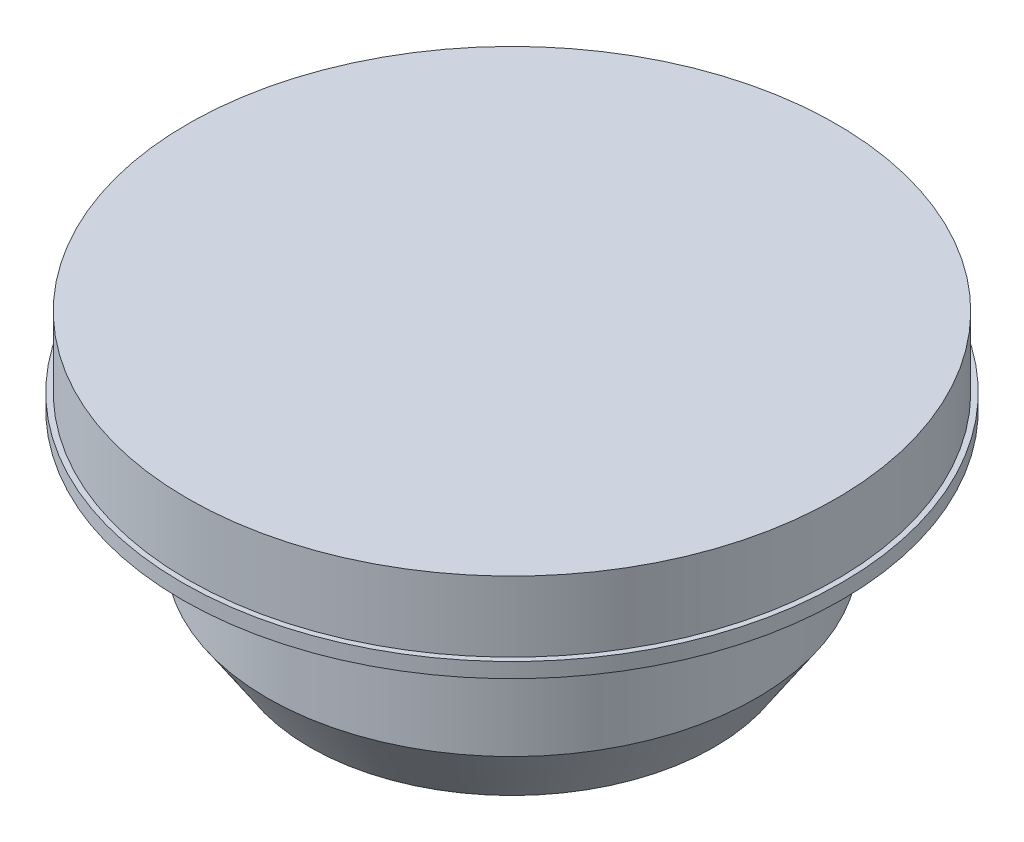
ISO-10303-21;
HEADER;
FILE_DESCRIPTION(('STEP AP214'),'2;1');
FILE_NAME('part.step','',(''),(''),'','','');
FILE_SCHEMA(('AUTOMOTIVE_DESIGN { 1 0 10303 214 1 1 1 1 }'));
ENDSEC;
DATA;
#1=APPLICATION_CONTEXT('core data for automotive mechanical design processes');
#2=APPLICATION_PROTOCOL_DEFINITION('international standard','automotive_design',2000,#1);
#3=PRODUCT_CONTEXT('',#1,'mechanical');
#4=PRODUCT('Part','Part','',(#3));
#5=PRODUCT_RELATED_PRODUCT_CATEGORY('part','',(#4));
#6=PRODUCT_DEFINITION_FORMATION('','',#4);
#7=PRODUCT_DEFINITION_CONTEXT('part definition',#1,'design');
#8=PRODUCT_DEFINITION('design','',#6,#7);
#9=PRODUCT_DEFINITION_SHAPE('','',#8);
#10=(LENGTH_UNIT() NAMED_UNIT(*) SI_UNIT(.MILLI.,.METRE.));
#11=(NAMED_UNIT(*) PLANE_ANGLE_UNIT() SI_UNIT($,.RADIAN.));
#12=(NAMED_UNIT(*) SI_UNIT($,.STERADIAN.) SOLID_ANGLE_UNIT());
#13=UNCERTAINTY_MEASURE_WITH_UNIT(LENGTH_MEASURE(1.E-05),#10,'distance_accuracy_value','');
#14=(GEOMETRIC_REPRESENTATION_CONTEXT(3) GLOBAL_UNCERTAINTY_ASSIGNED_CONTEXT((#13)) GLOBAL_UNIT_ASSIGNED_CONTEXT((#10,
#11,#12)) REPRESENTATION_CONTEXT('',''));
#15=CARTESIAN_POINT('',(0.,0.,0.));
#16=DIRECTION('',(0.,0.,1.));
#17=DIRECTION('',(1.,0.,0.));
#18=AXIS2_PLACEMENT_3D('',#15,#16,#17);
#19=CARTESIAN_POINT('',(0.,0.4,0.));
#20=DIRECTION('',(0.,-1.,0.));
#21=DIRECTION('',(0.,0.,-1.));
#22=AXIS2_PLACEMENT_3D('',#19,#20,#21);
#23=CYLINDRICAL_SURFACE('',#22,1.525);
#24=CARTESIAN_POINT('',(0.,0.07,0.));
#25=DIRECTION('',(0.,1.,0.));
#26=DIRECTION('',(0.,0.,1.));
#27=AXIS2_PLACEMENT_3D('',#24,#25,#26);
#28=CIRCLE('',#27,1.525);
#29=CARTESIAN_POINT('',(0.,0.07,1.525));
#30=VERTEX_POINT('',#29);
#31=EDGE_CURVE('E40',#30,#30,#28,.T.);
#32=ORIENTED_EDGE('',*,*,#31,.T.);
#33=EDGE_LOOP('',(#32));
#34=FACE_BOUND('',#33,.T.);
#35=CARTESIAN_POINT('',(0.,0.4,0.));
#36=DIRECTION('',(0.,1.,0.));
#37=DIRECTION('',(0.,0.,1.));
#38=AXIS2_PLACEMENT_3D('',#35,#36,#37);
#39=CIRCLE('',#38,1.525);
#40=CARTESIAN_POINT('',(0.,0.4,1.525));
#41=VERTEX_POINT('',#40);
#42=EDGE_CURVE('E10',#41,#41,#39,.T.);
#43=ORIENTED_EDGE('',*,*,#42,.F.);
#44=EDGE_LOOP('',(#43));
#45=FACE_BOUND('',#44,.T.);
#46=ADVANCED_FACE('F37',(#34,#45),#23,.T.);
#47=CARTESIAN_POINT('',(0.,0.4,0.));
#48=DIRECTION('',(0.,1.,0.));
#49=DIRECTION('',(0.,0.,1.));
#50=AXIS2_PLACEMENT_3D('',#47,#48,#49);
#51=PLANE('',#50);
#52=ORIENTED_EDGE('',*,*,#42,.T.);
#53=EDGE_LOOP('',(#52));
#54=FACE_BOUND('',#53,.T.);
#55=ADVANCED_FACE('F91',(#54),#51,.T.);
#56=CARTESIAN_POINT('',(0.,0.,0.));
#57=DIRECTION('',(0.,1.,0.));
#58=DIRECTION('',(0.,0.,1.));
#59=AXIS2_PLACEMENT_3D('',#56,#57,#58);
#60=CYLINDRICAL_SURFACE('',#59,1.55);
#61=CARTESIAN_POINT('',(0.,0.,0.));
#62=DIRECTION('',(0.,1.,0.));
#63=DIRECTION('',(0.,0.,1.));
#64=AXIS2_PLACEMENT_3D('',#61,#62,#63);
#65=CIRCLE('',#64,1.55);
#66=CARTESIAN_POINT('',(0.,0.,1.55));
#67=VERTEX_POINT('',#66);
#68=EDGE_CURVE('E47',#67,#67,#65,.T.);
#69=ORIENTED_EDGE('',*,*,#68,.T.);
#70=EDGE_LOOP('',(#69));
#71=FACE_BOUND('',#70,.T.);
#72=CARTESIAN_POINT('',(0.,0.07,0.));
#73=DIRECTION('',(0.,1.,0.));
#74=DIRECTION('',(0.,0.,1.));
#75=AXIS2_PLACEMENT_3D('',#72,#73,#74);
#76=CIRCLE('',#75,1.55);
#77=CARTESIAN_POINT('',(0.,0.07,1.55));
#78=VERTEX_POINT('',#77);
#79=EDGE_CURVE('E49',#78,#78,#76,.T.);
#80=ORIENTED_EDGE('',*,*,#79,.F.);
#81=EDGE_LOOP('',(#80));
#82=FACE_BOUND('',#81,.T.);
#83=ADVANCED_FACE('F96',(#71,#82),#60,.T.);
#84=CARTESIAN_POINT('',(0.,0.07,0.));
#85=DIRECTION('',(0.,1.,0.));
#86=DIRECTION('',(0.,0.,1.));
#87=AXIS2_PLACEMENT_3D('',#84,#85,#86);
#88=PLANE('',#87);
#89=ORIENTED_EDGE('',*,*,#31,.F.);
#90=EDGE_LOOP('',(#89));
#91=FACE_BOUND('',#90,.T.);
#92=ORIENTED_EDGE('',*,*,#79,.T.);
#93=EDGE_LOOP('',(#92));
#94=FACE_BOUND('',#93,.T.);
#95=ADVANCED_FACE('F101',(#91,#94),#88,.T.);
#96=CARTESIAN_POINT('',(0.,0.,0.));
#97=DIRECTION('',(0.,1.,0.));
#98=DIRECTION('',(0.,0.,1.));
#99=AXIS2_PLACEMENT_3D('',#96,#97,#98);
#100=PLANE('',#99);
#101=CARTESIAN_POINT('',(0.,0.,0.));
#102=DIRECTION('',(0.,1.,0.));
#103=DIRECTION('',(0.,0.,1.));
#104=AXIS2_PLACEMENT_3D('',#101,#102,#103);
#105=CIRCLE('',#104,1.25);
#106=CARTESIAN_POINT('',(0.,0.,1.25));
#107=VERTEX_POINT('',#106);
#108=EDGE_CURVE('E60',#107,#107,#105,.T.);
#109=ORIENTED_EDGE('',*,*,#108,.T.);
#110=EDGE_LOOP('',(#109));
#111=FACE_BOUND('',#110,.T.);
#112=ORIENTED_EDGE('',*,*,#68,.F.);
#113=EDGE_LOOP('',(#112));
#114=FACE_BOUND('',#113,.T.);
#115=ADVANCED_FACE('F88',(#111,#114),#100,.F.);
#116=CARTESIAN_POINT('',(0.,0.,0.));
#117=DIRECTION('',(0.,1.,0.));
#118=DIRECTION('',(0.,0.,1.));
#119=AXIS2_PLACEMENT_3D('',#116,#117,#118);
#120=CONICAL_SURFACE('',#119,1.25,0.785398163397448);
#121=CARTESIAN_POINT('',(0.,-0.1,0.));
#122=DIRECTION('',(0.,1.,0.));
#123=DIRECTION('',(0.,0.,1.));
#124=AXIS2_PLACEMENT_3D('',#121,#122,#123);
#125=CIRCLE('',#124,1.15);
#126=CARTESIAN_POINT('',(0.,-0.1,1.15));
#127=VERTEX_POINT('',#126);
#128=EDGE_CURVE('E63',#127,#127,#125,.T.);
#129=ORIENTED_EDGE('',*,*,#128,.T.);
#130=EDGE_LOOP('',(#129));
#131=FACE_BOUND('',#130,.T.);
#132=ORIENTED_EDGE('',*,*,#108,.F.);
#133=EDGE_LOOP('',(#132));
#134=FACE_BOUND('',#133,.T.);
#135=ADVANCED_FACE('F67',(#131,#134),#120,.T.);
#136=CARTESIAN_POINT('',(0.,-0.9,0.));
#137=DIRECTION('',(0.,-1.,0.));
#138=DIRECTION('',(0.,0.,-1.));
#139=AXIS2_PLACEMENT_3D('',#136,#137,#138);
#140=PLANE('',#139);
#141=CARTESIAN_POINT('',(0.,-0.9,0.));
#142=DIRECTION('',(0.,1.,0.));
#143=DIRECTION('',(0.,0.,1.));
#144=AXIS2_PLACEMENT_3D('',#141,#142,#143);
#145=CIRCLE('',#144,0.95);
#146=CARTESIAN_POINT('',(0.,-0.9,0.95));
#147=VERTEX_POINT('',#146);
#148=EDGE_CURVE('E52',#147,#147,#145,.T.);
#149=ORIENTED_EDGE('',*,*,#148,.F.);
#150=EDGE_LOOP('',(#149));
#151=FACE_BOUND('',#150,.T.);
#152=ADVANCED_FACE('F79',(#151),#140,.T.);
#153=CARTESIAN_POINT('',(0.,-0.9,0.));
#154=DIRECTION('',(0.,1.,0.));
#155=DIRECTION('',(0.,0.,1.));
#156=AXIS2_PLACEMENT_3D('',#153,#154,#155);
#157=CONICAL_SURFACE('',#156,0.95,0.588002603547568);
#158=CARTESIAN_POINT('',(0.,-0.6,0.));
#159=DIRECTION('',(0.,1.,0.));
#160=DIRECTION('',(0.,0.,1.));
#161=AXIS2_PLACEMENT_3D('',#158,#159,#160);
#162=CIRCLE('',#161,1.15);
#163=CARTESIAN_POINT('',(0.,-0.6,1.15));
#164=VERTEX_POINT('',#163);
#165=EDGE_CURVE('E57',#164,#164,#162,.T.);
#166=ORIENTED_EDGE('',*,*,#165,.F.);
#167=EDGE_LOOP('',(#166));
#168=FACE_BOUND('',#167,.T.);
#169=ORIENTED_EDGE('',*,*,#148,.T.);
#170=EDGE_LOOP('',(#169));
#171=FACE_BOUND('',#170,.T.);
#172=ADVANCED_FACE('F73',(#168,#171),#157,.T.);
#173=CARTESIAN_POINT('',(0.,-0.9,0.));
#174=DIRECTION('',(0.,1.,0.));
#175=DIRECTION('',(0.,0.,1.));
#176=AXIS2_PLACEMENT_3D('',#173,#174,#175);
#177=CYLINDRICAL_SURFACE('',#176,1.15);
#178=ORIENTED_EDGE('',*,*,#128,.F.);
#179=EDGE_LOOP('',(#178));
#180=FACE_BOUND('',#179,.T.);
#181=ORIENTED_EDGE('',*,*,#165,.T.);
#182=EDGE_LOOP('',(#181));
#183=FACE_BOUND('',#182,.T.);
#184=ADVANCED_FACE('F70',(#180,#183),#177,.T.);
#185=CLOSED_SHELL('',(#46,#55,#83,#95,#115,#135,#152,#172,#184));
#186=MANIFOLD_SOLID_BREP('B2',#185);
#187=ADVANCED_BREP_SHAPE_REPRESENTATION('',(#18,#186),#14);
#188=SHAPE_DEFINITION_REPRESENTATION(#9,#187);
ENDSEC;
END-ISO-10303-21;
